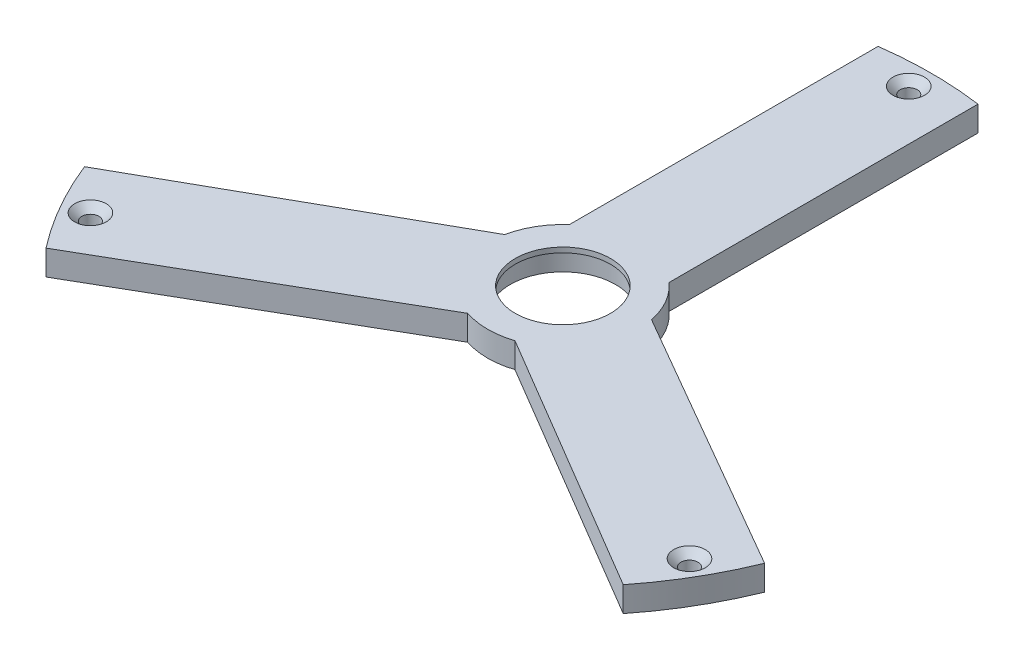
ISO-10303-21;
HEADER;
FILE_DESCRIPTION(('STEP AP214'),'2;1');
FILE_NAME('part.step','',(''),(''),'','','');
FILE_SCHEMA(('AUTOMOTIVE_DESIGN { 1 0 10303 214 1 1 1 1 }'));
ENDSEC;
DATA;
#1=APPLICATION_CONTEXT('core data for automotive mechanical design processes');
#2=APPLICATION_PROTOCOL_DEFINITION('international standard','automotive_design',2000,#1);
#3=PRODUCT_CONTEXT('',#1,'mechanical');
#4=PRODUCT('Part','Part','',(#3));
#5=PRODUCT_RELATED_PRODUCT_CATEGORY('part','',(#4));
#6=PRODUCT_DEFINITION_FORMATION('','',#4);
#7=PRODUCT_DEFINITION_CONTEXT('part definition',#1,'design');
#8=PRODUCT_DEFINITION('design','',#6,#7);
#9=PRODUCT_DEFINITION_SHAPE('','',#8);
#10=(LENGTH_UNIT() NAMED_UNIT(*) SI_UNIT(.MILLI.,.METRE.));
#11=(NAMED_UNIT(*) PLANE_ANGLE_UNIT() SI_UNIT($,.RADIAN.));
#12=(NAMED_UNIT(*) SI_UNIT($,.STERADIAN.) SOLID_ANGLE_UNIT());
#13=UNCERTAINTY_MEASURE_WITH_UNIT(LENGTH_MEASURE(1.E-05),#10,'distance_accuracy_value','');
#14=(GEOMETRIC_REPRESENTATION_CONTEXT(3) GLOBAL_UNCERTAINTY_ASSIGNED_CONTEXT((#13)) GLOBAL_UNIT_ASSIGNED_CONTEXT((#10,
#11,#12)) REPRESENTATION_CONTEXT('',''));
#15=CARTESIAN_POINT('',(0.,0.,0.));
#16=DIRECTION('',(0.,0.,1.));
#17=DIRECTION('',(1.,0.,0.));
#18=AXIS2_PLACEMENT_3D('',#15,#16,#17);
#19=CARTESIAN_POINT('',(0.,5.,0.));
#20=DIRECTION('',(0.,-1.,0.));
#21=DIRECTION('',(0.,0.,-1.));
#22=AXIS2_PLACEMENT_3D('',#19,#20,#21);
#23=CYLINDRICAL_SURFACE('',#22,15.);
#24=CARTESIAN_POINT('',(0.,0.,0.));
#25=DIRECTION('',(0.,1.,0.));
#26=DIRECTION('',(0.,0.,1.));
#27=AXIS2_PLACEMENT_3D('',#24,#25,#26);
#28=CIRCLE('',#27,15.);
#29=CARTESIAN_POINT('',(-4.75321733485036,0.,14.2269787716042));
#30=VERTEX_POINT('',#29);
#31=CARTESIAN_POINT('',(4.68941752869024,0.,14.2481354303506));
#32=VERTEX_POINT('',#31);
#33=EDGE_CURVE('E158',#30,#32,#28,.T.);
#34=ORIENTED_EDGE('',*,*,#33,.T.);
#35=DIRECTION('',(0.,-1.,0.));
#36=VECTOR('',#35,1.);
#37=CARTESIAN_POINT('',(4.68941752869024,5.,14.2481354303506));
#38=LINE('',#37,#36);
#39=CARTESIAN_POINT('',(4.68941752869024,5.,14.2481354303506));
#40=VERTEX_POINT('',#39);
#41=EDGE_CURVE('E11',#40,#32,#38,.T.);
#42=ORIENTED_EDGE('',*,*,#41,.F.);
#43=CARTESIAN_POINT('',(0.,5.,0.));
#44=DIRECTION('',(0.,1.,0.));
#45=DIRECTION('',(0.,0.,1.));
#46=AXIS2_PLACEMENT_3D('',#43,#44,#45);
#47=CIRCLE('',#46,15.);
#48=CARTESIAN_POINT('',(-4.75321733485036,5.,14.2269787716042));
#49=VERTEX_POINT('',#48);
#50=EDGE_CURVE('E181',#49,#40,#47,.T.);
#51=ORIENTED_EDGE('',*,*,#50,.F.);
#52=DIRECTION('',(0.,-1.,0.));
#53=VECTOR('',#52,1.);
#54=CARTESIAN_POINT('',(-4.75321733485036,5.,14.2269787716042));
#55=LINE('',#54,#53);
#56=EDGE_CURVE('E154',#49,#30,#55,.T.);
#57=ORIENTED_EDGE('',*,*,#56,.T.);
#58=EDGE_LOOP('',(#34,#42,#51,#57));
#59=FACE_BOUND('',#58,.T.);
#60=ADVANCED_FACE('F37',(#59),#23,.T.);
#61=CARTESIAN_POINT('',(4.68941752869024,5.,14.2481354303506));
#62=DIRECTION('',(0.509477878302837,0.,-0.860483754361487));
#63=DIRECTION('',(-0.860483754361487,0.,-0.509477878302837));
#64=AXIS2_PLACEMENT_3D('',#61,#62,#63);
#65=PLANE('',#64);
#66=DIRECTION('',(0.860483754361487,0.,0.509477878302837));
#67=VECTOR('',#66,1.);
#68=CARTESIAN_POINT('',(4.68941752869024,0.,14.2481354303506));
#69=LINE('',#68,#67);
#70=CARTESIAN_POINT('',(57.64346216512,0.,45.601329691341));
#71=VERTEX_POINT('',#70);
#72=EDGE_CURVE('E161',#32,#71,#69,.T.);
#73=ORIENTED_EDGE('',*,*,#72,.T.);
#74=DIRECTION('',(0.,-1.,0.));
#75=VECTOR('',#74,1.);
#76=CARTESIAN_POINT('',(57.64346216512,5.,45.601329691341));
#77=LINE('',#76,#75);
#78=CARTESIAN_POINT('',(57.64346216512,5.,45.601329691341));
#79=VERTEX_POINT('',#78);
#80=EDGE_CURVE('E46',#79,#71,#77,.T.);
#81=ORIENTED_EDGE('',*,*,#80,.F.);
#82=DIRECTION('',(0.860483754361487,0.,0.509477878302837));
#83=VECTOR('',#82,1.);
#84=CARTESIAN_POINT('',(4.68941752869024,5.,14.2481354303506));
#85=LINE('',#84,#83);
#86=EDGE_CURVE('E109',#40,#79,#85,.T.);
#87=ORIENTED_EDGE('',*,*,#86,.F.);
#88=ORIENTED_EDGE('',*,*,#41,.T.);
#89=EDGE_LOOP('',(#73,#81,#87,#88));
#90=FACE_BOUND('',#89,.T.);
#91=ADVANCED_FACE('F261',(#90),#65,.F.);
#92=CARTESIAN_POINT('',(0.,5.,0.));
#93=DIRECTION('',(0.,-1.,0.));
#94=DIRECTION('',(0.,0.,-1.));
#95=AXIS2_PLACEMENT_3D('',#92,#93,#94);
#96=CYLINDRICAL_SURFACE('',#95,73.5);
#97=CARTESIAN_POINT('',(0.,0.,0.));
#98=DIRECTION('',(0.,1.,0.));
#99=DIRECTION('',(0.,0.,1.));
#100=AXIS2_PLACEMENT_3D('',#97,#98,#99);
#101=CIRCLE('',#100,73.5);
#102=CARTESIAN_POINT('',(68.0397443830476,0.,27.8000572713356));
#103=VERTEX_POINT('',#102);
#104=EDGE_CURVE('E164',#71,#103,#101,.T.);
#105=ORIENTED_EDGE('',*,*,#104,.T.);
#106=DIRECTION('',(0.,-1.,0.));
#107=VECTOR('',#106,1.);
#108=CARTESIAN_POINT('',(68.0397443830476,5.,27.8000572713356));
#109=LINE('',#108,#107);
#110=CARTESIAN_POINT('',(68.0397443830476,5.,27.8000572713356));
#111=VERTEX_POINT('',#110);
#112=EDGE_CURVE('E200',#111,#103,#109,.T.);
#113=ORIENTED_EDGE('',*,*,#112,.F.);
#114=CARTESIAN_POINT('',(0.,5.,0.));
#115=DIRECTION('',(0.,1.,0.));
#116=DIRECTION('',(0.,0.,1.));
#117=AXIS2_PLACEMENT_3D('',#114,#115,#116);
#118=CIRCLE('',#117,73.5);
#119=EDGE_CURVE('E209',#79,#111,#118,.T.);
#120=ORIENTED_EDGE('',*,*,#119,.F.);
#121=ORIENTED_EDGE('',*,*,#80,.T.);
#122=EDGE_LOOP('',(#105,#113,#120,#121));
#123=FACE_BOUND('',#122,.T.);
#124=ADVANCED_FACE('F207',(#123),#96,.T.);
#125=CARTESIAN_POINT('',(14.6975337027367,5.,-2.99708242411159));
#126=DIRECTION('',(-0.5,0.,0.866025403784439));
#127=DIRECTION('',(0.866025403784439,0.,0.5));
#128=AXIS2_PLACEMENT_3D('',#125,#126,#127);
#129=PLANE('',#128);
#130=DIRECTION('',(-0.866025403784439,0.,-0.5));
#131=VECTOR('',#130,1.);
#132=CARTESIAN_POINT('',(14.6975337027367,0.,-2.99708242411159));
#133=LINE('',#132,#131);
#134=CARTESIAN_POINT('',(14.6975337027367,0.,-2.99708242411159));
#135=VERTEX_POINT('',#134);
#136=EDGE_CURVE('E166',#103,#135,#133,.T.);
#137=ORIENTED_EDGE('',*,*,#136,.T.);
#138=DIRECTION('',(0.,-1.,0.));
#139=VECTOR('',#138,1.);
#140=CARTESIAN_POINT('',(14.6975337027367,5.,-2.99708242411159));
#141=LINE('',#140,#139);
#142=CARTESIAN_POINT('',(14.6975337027367,5.,-2.99708242411159));
#143=VERTEX_POINT('',#142);
#144=EDGE_CURVE('E197',#143,#135,#141,.T.);
#145=ORIENTED_EDGE('',*,*,#144,.F.);
#146=DIRECTION('',(-0.866025403784439,0.,-0.5));
#147=VECTOR('',#146,1.);
#148=CARTESIAN_POINT('',(14.6975337027367,5.,-2.99708242411159));
#149=LINE('',#148,#147);
#150=EDGE_CURVE('E227',#111,#143,#149,.T.);
#151=ORIENTED_EDGE('',*,*,#150,.F.);
#152=ORIENTED_EDGE('',*,*,#112,.T.);
#153=EDGE_LOOP('',(#137,#145,#151,#152));
#154=FACE_BOUND('',#153,.T.);
#155=ADVANCED_FACE('F218',(#154),#129,.F.);
#156=CARTESIAN_POINT('',(0.,5.,0.));
#157=DIRECTION('',(0.,-1.,0.));
#158=DIRECTION('',(0.,0.,-1.));
#159=AXIS2_PLACEMENT_3D('',#156,#157,#158);
#160=CYLINDRICAL_SURFACE('',#159,15.);
#161=CARTESIAN_POINT('',(0.,0.,0.));
#162=DIRECTION('',(0.,1.,0.));
#163=DIRECTION('',(0.,0.,1.));
#164=AXIS2_PLACEMENT_3D('',#161,#162,#163);
#165=CIRCLE('',#164,15.);
#166=CARTESIAN_POINT('',(9.99999999999999,0.,-11.180339887499));
#167=VERTEX_POINT('',#166);
#168=EDGE_CURVE('E168',#135,#167,#165,.T.);
#169=ORIENTED_EDGE('',*,*,#168,.T.);
#170=DIRECTION('',(0.,-1.,0.));
#171=VECTOR('',#170,1.);
#172=CARTESIAN_POINT('',(9.99999999999999,5.,-11.180339887499));
#173=LINE('',#172,#171);
#174=CARTESIAN_POINT('',(9.99999999999999,5.,-11.180339887499));
#175=VERTEX_POINT('',#174);
#176=EDGE_CURVE('E194',#175,#167,#173,.T.);
#177=ORIENTED_EDGE('',*,*,#176,.F.);
#178=CARTESIAN_POINT('',(0.,5.,0.));
#179=DIRECTION('',(0.,1.,0.));
#180=DIRECTION('',(0.,0.,1.));
#181=AXIS2_PLACEMENT_3D('',#178,#179,#180);
#182=CIRCLE('',#181,15.);
#183=EDGE_CURVE('E224',#143,#175,#182,.T.);
#184=ORIENTED_EDGE('',*,*,#183,.F.);
#185=ORIENTED_EDGE('',*,*,#144,.T.);
#186=EDGE_LOOP('',(#169,#177,#184,#185));
#187=FACE_BOUND('',#186,.T.);
#188=ADVANCED_FACE('F222',(#187),#160,.T.);
#189=CARTESIAN_POINT('',(10.,5.,-11.180339887499));
#190=DIRECTION('',(-1.,0.,0.));
#191=DIRECTION('',(0.,0.,1.));
#192=AXIS2_PLACEMENT_3D('',#189,#190,#191);
#193=PLANE('',#192);
#194=DIRECTION('',(0.,0.,-1.));
#195=VECTOR('',#194,1.);
#196=CARTESIAN_POINT('',(10.,0.,-11.180339887499));
#197=LINE('',#196,#195);
#198=CARTESIAN_POINT('',(10.,0.,-72.8165503165317));
#199=VERTEX_POINT('',#198);
#200=EDGE_CURVE('E170',#167,#199,#197,.T.);
#201=ORIENTED_EDGE('',*,*,#200,.T.);
#202=DIRECTION('',(0.,-1.,0.));
#203=VECTOR('',#202,1.);
#204=CARTESIAN_POINT('',(10.,5.,-72.8165503165317));
#205=LINE('',#204,#203);
#206=CARTESIAN_POINT('',(10.,5.,-72.8165503165317));
#207=VERTEX_POINT('',#206);
#208=EDGE_CURVE('E191',#207,#199,#205,.T.);
#209=ORIENTED_EDGE('',*,*,#208,.F.);
#210=DIRECTION('',(0.,0.,-1.));
#211=VECTOR('',#210,1.);
#212=CARTESIAN_POINT('',(10.,5.,-11.180339887499));
#213=LINE('',#212,#211);
#214=EDGE_CURVE('E226',#175,#207,#213,.T.);
#215=ORIENTED_EDGE('',*,*,#214,.F.);
#216=ORIENTED_EDGE('',*,*,#176,.T.);
#217=EDGE_LOOP('',(#201,#209,#215,#216));
#218=FACE_BOUND('',#217,.T.);
#219=ADVANCED_FACE('F274',(#218),#193,.F.);
#220=CARTESIAN_POINT('',(0.,5.,0.));
#221=DIRECTION('',(0.,-1.,0.));
#222=DIRECTION('',(0.,0.,-1.));
#223=AXIS2_PLACEMENT_3D('',#220,#221,#222);
#224=CYLINDRICAL_SURFACE('',#223,73.5);
#225=CARTESIAN_POINT('',(0.,0.,0.));
#226=DIRECTION('',(0.,1.,0.));
#227=DIRECTION('',(0.,0.,1.));
#228=AXIS2_PLACEMENT_3D('',#225,#226,#227);
#229=CIRCLE('',#228,73.5);
#230=CARTESIAN_POINT('',(-9.94431636788529,0.,-72.8241757383866));
#231=VERTEX_POINT('',#230);
#232=EDGE_CURVE('E172',#199,#231,#229,.T.);
#233=ORIENTED_EDGE('',*,*,#232,.T.);
#234=DIRECTION('',(0.,-1.,0.));
#235=VECTOR('',#234,1.);
#236=CARTESIAN_POINT('',(-9.94431636788529,5.,-72.8241757383866));
#237=LINE('',#236,#235);
#238=CARTESIAN_POINT('',(-9.94431636788529,5.,-72.8241757383866));
#239=VERTEX_POINT('',#238);
#240=EDGE_CURVE('E188',#239,#231,#237,.T.);
#241=ORIENTED_EDGE('',*,*,#240,.F.);
#242=CARTESIAN_POINT('',(0.,5.,0.));
#243=DIRECTION('',(0.,1.,0.));
#244=DIRECTION('',(0.,0.,1.));
#245=AXIS2_PLACEMENT_3D('',#242,#243,#244);
#246=CIRCLE('',#245,73.5);
#247=EDGE_CURVE('E229',#207,#239,#246,.T.);
#248=ORIENTED_EDGE('',*,*,#247,.F.);
#249=ORIENTED_EDGE('',*,*,#208,.T.);
#250=EDGE_LOOP('',(#233,#241,#248,#249));
#251=FACE_BOUND('',#250,.T.);
#252=ADVANCED_FACE('F277',(#251),#224,.T.);
#253=CARTESIAN_POINT('',(-9.94431636788531,5.,-11.2298963474917));
#254=DIRECTION('',(1.,0.,0.));
#255=DIRECTION('',(0.,0.,-1.));
#256=AXIS2_PLACEMENT_3D('',#253,#254,#255);
#257=PLANE('',#256);
#258=DIRECTION('',(0.,0.,1.));
#259=VECTOR('',#258,1.);
#260=CARTESIAN_POINT('',(-9.94431636788531,0.,-11.2298963474917));
#261=LINE('',#260,#259);
#262=CARTESIAN_POINT('',(-9.94431636788531,0.,-11.2298963474917));
#263=VERTEX_POINT('',#262);
#264=EDGE_CURVE('E174',#231,#263,#261,.T.);
#265=ORIENTED_EDGE('',*,*,#264,.T.);
#266=DIRECTION('',(0.,-1.,0.));
#267=VECTOR('',#266,1.);
#268=CARTESIAN_POINT('',(-9.94431636788531,5.,-11.2298963474917));
#269=LINE('',#268,#267);
#270=CARTESIAN_POINT('',(-9.94431636788531,5.,-11.2298963474917));
#271=VERTEX_POINT('',#270);
#272=EDGE_CURVE('E185',#271,#263,#269,.T.);
#273=ORIENTED_EDGE('',*,*,#272,.F.);
#274=DIRECTION('',(0.,0.,1.));
#275=VECTOR('',#274,1.);
#276=CARTESIAN_POINT('',(-9.94431636788531,5.,-11.2298963474917));
#277=LINE('',#276,#275);
#278=EDGE_CURVE('E235',#239,#271,#277,.T.);
#279=ORIENTED_EDGE('',*,*,#278,.F.);
#280=ORIENTED_EDGE('',*,*,#240,.T.);
#281=EDGE_LOOP('',(#265,#273,#279,#280));
#282=FACE_BOUND('',#281,.T.);
#283=ADVANCED_FACE('F241',(#282),#257,.F.);
#284=CARTESIAN_POINT('',(0.,5.,0.));
#285=DIRECTION('',(0.,-1.,0.));
#286=DIRECTION('',(0.,0.,-1.));
#287=AXIS2_PLACEMENT_3D('',#284,#285,#286);
#288=CYLINDRICAL_SURFACE('',#287,15.);
#289=CARTESIAN_POINT('',(0.,0.,0.));
#290=DIRECTION('',(0.,1.,0.));
#291=DIRECTION('',(0.,0.,1.));
#292=AXIS2_PLACEMENT_3D('',#289,#290,#291);
#293=CIRCLE('',#292,15.);
#294=CARTESIAN_POINT('',(-14.6838056500031,0.,-3.06363373021944));
#295=VERTEX_POINT('',#294);
#296=EDGE_CURVE('E176',#263,#295,#293,.T.);
#297=ORIENTED_EDGE('',*,*,#296,.T.);
#298=DIRECTION('',(0.,-1.,0.));
#299=VECTOR('',#298,1.);
#300=CARTESIAN_POINT('',(-14.6838056500031,5.,-3.06363373021944));
#301=LINE('',#300,#299);
#302=CARTESIAN_POINT('',(-14.6838056500031,5.,-3.06363373021944));
#303=VERTEX_POINT('',#302);
#304=EDGE_CURVE('E149',#303,#295,#301,.T.);
#305=ORIENTED_EDGE('',*,*,#304,.F.);
#306=CARTESIAN_POINT('',(0.,5.,0.));
#307=DIRECTION('',(0.,1.,0.));
#308=DIRECTION('',(0.,0.,1.));
#309=AXIS2_PLACEMENT_3D('',#306,#307,#308);
#310=CIRCLE('',#309,15.);
#311=EDGE_CURVE('E140',#271,#303,#310,.T.);
#312=ORIENTED_EDGE('',*,*,#311,.F.);
#313=ORIENTED_EDGE('',*,*,#272,.T.);
#314=EDGE_LOOP('',(#297,#305,#312,#313));
#315=FACE_BOUND('',#314,.T.);
#316=ADVANCED_FACE('F245',(#315),#288,.T.);
#317=CARTESIAN_POINT('',(-14.6838056500031,5.,-3.06363373021944));
#318=DIRECTION('',(0.490469701584845,0.,0.871458244454244));
#319=DIRECTION('',(0.871458244454244,0.,-0.490469701584845));
#320=AXIS2_PLACEMENT_3D('',#317,#318,#319);
#321=PLANE('',#320);
#322=DIRECTION('',(-0.871458244454244,0.,0.490469701584845));
#323=VECTOR('',#322,1.);
#324=CARTESIAN_POINT('',(-14.6838056500031,0.,-3.06363373021944));
#325=LINE('',#324,#323);
#326=CARTESIAN_POINT('',(-68.3136410416104,0.,27.1200377514118));
#327=VERTEX_POINT('',#326);
#328=EDGE_CURVE('E148',#295,#327,#325,.T.);
#329=ORIENTED_EDGE('',*,*,#328,.T.);
#330=DIRECTION('',(0.,-1.,0.));
#331=VECTOR('',#330,1.);
#332=CARTESIAN_POINT('',(-68.3136410416104,5.,27.1200377514118));
#333=LINE('',#332,#331);
#334=CARTESIAN_POINT('',(-68.3136410416104,5.,27.1200377514118));
#335=VERTEX_POINT('',#334);
#336=EDGE_CURVE('E145',#335,#327,#333,.T.);
#337=ORIENTED_EDGE('',*,*,#336,.F.);
#338=DIRECTION('',(-0.871458244454244,0.,0.490469701584845));
#339=VECTOR('',#338,1.);
#340=CARTESIAN_POINT('',(-14.6838056500031,5.,-3.06363373021944));
#341=LINE('',#340,#339);
#342=EDGE_CURVE('E134',#303,#335,#341,.T.);
#343=ORIENTED_EDGE('',*,*,#342,.F.);
#344=ORIENTED_EDGE('',*,*,#304,.T.);
#345=EDGE_LOOP('',(#329,#337,#343,#344));
#346=FACE_BOUND('',#345,.T.);
#347=ADVANCED_FACE('F146',(#346),#321,.F.);
#348=CARTESIAN_POINT('',(0.,5.,0.));
#349=DIRECTION('',(0.,-1.,0.));
#350=DIRECTION('',(0.,0.,-1.));
#351=AXIS2_PLACEMENT_3D('',#348,#349,#350);
#352=CYLINDRICAL_SURFACE('',#351,73.5);
#353=CARTESIAN_POINT('',(0.,0.,0.));
#354=DIRECTION('',(0.,1.,0.));
#355=DIRECTION('',(0.,0.,1.));
#356=AXIS2_PLACEMENT_3D('',#353,#354,#355);
#357=CIRCLE('',#356,73.5);
#358=CARTESIAN_POINT('',(-58.095428015162,0.,45.0241184670519));
#359=VERTEX_POINT('',#358);
#360=EDGE_CURVE('E95',#327,#359,#357,.T.);
#361=ORIENTED_EDGE('',*,*,#360,.T.);
#362=DIRECTION('',(0.,-1.,0.));
#363=VECTOR('',#362,1.);
#364=CARTESIAN_POINT('',(-58.095428015162,5.,45.0241184670519));
#365=LINE('',#364,#363);
#366=CARTESIAN_POINT('',(-58.095428015162,5.,45.0241184670519));
#367=VERTEX_POINT('',#366);
#368=EDGE_CURVE('E150',#367,#359,#365,.T.);
#369=ORIENTED_EDGE('',*,*,#368,.F.);
#370=CARTESIAN_POINT('',(0.,5.,0.));
#371=DIRECTION('',(0.,1.,0.));
#372=DIRECTION('',(0.,0.,1.));
#373=AXIS2_PLACEMENT_3D('',#370,#371,#372);
#374=CIRCLE('',#373,73.5);
#375=EDGE_CURVE('E138',#335,#367,#374,.T.);
#376=ORIENTED_EDGE('',*,*,#375,.F.);
#377=ORIENTED_EDGE('',*,*,#336,.T.);
#378=EDGE_LOOP('',(#361,#369,#376,#377));
#379=FACE_BOUND('',#378,.T.);
#380=ADVANCED_FACE('F152',(#379),#352,.T.);
#381=CARTESIAN_POINT('',(-4.75321733485036,5.,14.2269787716042));
#382=DIRECTION('',(-0.5,0.,-0.866025403784439));
#383=DIRECTION('',(-0.866025403784439,0.,0.5));
#384=AXIS2_PLACEMENT_3D('',#381,#382,#383);
#385=PLANE('',#384);
#386=DIRECTION('',(0.866025403784439,0.,-0.5));
#387=VECTOR('',#386,1.);
#388=CARTESIAN_POINT('',(-4.75321733485036,0.,14.2269787716042));
#389=LINE('',#388,#387);
#390=EDGE_CURVE('E101',#359,#30,#389,.T.);
#391=ORIENTED_EDGE('',*,*,#390,.T.);
#392=ORIENTED_EDGE('',*,*,#56,.F.);
#393=DIRECTION('',(0.866025403784439,0.,-0.5));
#394=VECTOR('',#393,1.);
#395=CARTESIAN_POINT('',(-4.75321733485036,5.,14.2269787716042));
#396=LINE('',#395,#394);
#397=EDGE_CURVE('E54',#367,#49,#396,.T.);
#398=ORIENTED_EDGE('',*,*,#397,.F.);
#399=ORIENTED_EDGE('',*,*,#368,.T.);
#400=EDGE_LOOP('',(#391,#392,#398,#399));
#401=FACE_BOUND('',#400,.T.);
#402=ADVANCED_FACE('F249',(#401),#385,.F.);
#403=CARTESIAN_POINT('',(0.,5.,0.));
#404=DIRECTION('',(0.,1.,0.));
#405=DIRECTION('',(0.,0.,1.));
#406=AXIS2_PLACEMENT_3D('',#403,#404,#405);
#407=PLANE('',#406);
#408=CARTESIAN_POINT('',(-59.7557528611222,5.,34.5000000000024));
#409=DIRECTION('',(0.,1.,0.));
#410=DIRECTION('',(0.,0.,1.));
#411=AXIS2_PLACEMENT_3D('',#408,#409,#410);
#412=CIRCLE('',#411,3.15);
#413=CARTESIAN_POINT('',(-59.7557528611222,5.,37.6500000000024));
#414=VERTEX_POINT('',#413);
#415=EDGE_CURVE('E515',#414,#414,#412,.T.);
#416=ORIENTED_EDGE('',*,*,#415,.F.);
#417=EDGE_LOOP('',(#416));
#418=FACE_BOUND('',#417,.T.);
#419=CARTESIAN_POINT('',(0.,5.,-69.));
#420=DIRECTION('',(0.,1.,0.));
#421=DIRECTION('',(0.,0.,1.));
#422=AXIS2_PLACEMENT_3D('',#419,#420,#421);
#423=CIRCLE('',#422,3.15);
#424=CARTESIAN_POINT('',(0.,5.,-65.85));
#425=VERTEX_POINT('',#424);
#426=EDGE_CURVE('E522',#425,#425,#423,.T.);
#427=ORIENTED_EDGE('',*,*,#426,.F.);
#428=EDGE_LOOP('',(#427));
#429=FACE_BOUND('',#428,.T.);
#430=CARTESIAN_POINT('',(59.7557528611304,5.,34.4999999999976));
#431=DIRECTION('',(0.,1.,0.));
#432=DIRECTION('',(0.,0.,1.));
#433=AXIS2_PLACEMENT_3D('',#430,#431,#432);
#434=CIRCLE('',#433,3.15);
#435=CARTESIAN_POINT('',(59.7557528611304,5.,37.6499999999976));
#436=VERTEX_POINT('',#435);
#437=EDGE_CURVE('E531',#436,#436,#434,.T.);
#438=ORIENTED_EDGE('',*,*,#437,.F.);
#439=EDGE_LOOP('',(#438));
#440=FACE_BOUND('',#439,.T.);
#441=CARTESIAN_POINT('',(0.,5.,0.));
#442=DIRECTION('',(0.,1.,0.));
#443=DIRECTION('',(0.,0.,1.));
#444=AXIS2_PLACEMENT_3D('',#441,#442,#443);
#445=CIRCLE('',#444,9.5);
#446=CARTESIAN_POINT('',(0.,5.,9.5));
#447=VERTEX_POINT('',#446);
#448=EDGE_CURVE('E540',#447,#447,#445,.T.);
#449=ORIENTED_EDGE('',*,*,#448,.F.);
#450=EDGE_LOOP('',(#449));
#451=FACE_BOUND('',#450,.T.);
#452=ORIENTED_EDGE('',*,*,#50,.T.);
#453=ORIENTED_EDGE('',*,*,#86,.T.);
#454=ORIENTED_EDGE('',*,*,#119,.T.);
#455=ORIENTED_EDGE('',*,*,#150,.T.);
#456=ORIENTED_EDGE('',*,*,#183,.T.);
#457=ORIENTED_EDGE('',*,*,#214,.T.);
#458=ORIENTED_EDGE('',*,*,#247,.T.);
#459=ORIENTED_EDGE('',*,*,#278,.T.);
#460=ORIENTED_EDGE('',*,*,#311,.T.);
#461=ORIENTED_EDGE('',*,*,#342,.T.);
#462=ORIENTED_EDGE('',*,*,#375,.T.);
#463=ORIENTED_EDGE('',*,*,#397,.T.);
#464=EDGE_LOOP('',(#452,#453,#454,#455,#456,#457,#458,#459,#460,#461,#462,#463));
#465=FACE_BOUND('',#464,.T.);
#466=ADVANCED_FACE('F136',(#418,#429,#440,#451,#465),#407,.T.);
#467=CARTESIAN_POINT('',(0.,0.,0.));
#468=DIRECTION('',(0.,1.,0.));
#469=DIRECTION('',(0.,0.,1.));
#470=AXIS2_PLACEMENT_3D('',#467,#468,#469);
#471=PLANE('',#470);
#472=CARTESIAN_POINT('',(-59.7557528611222,0.,34.5000000000024));
#473=DIRECTION('',(0.,1.,0.));
#474=DIRECTION('',(0.,0.,1.));
#475=AXIS2_PLACEMENT_3D('',#472,#473,#474);
#476=CIRCLE('',#475,1.7);
#477=CARTESIAN_POINT('',(-59.7557528611222,0.,36.2000000000024));
#478=VERTEX_POINT('',#477);
#479=EDGE_CURVE('E517',#478,#478,#476,.T.);
#480=ORIENTED_EDGE('',*,*,#479,.T.);
#481=EDGE_LOOP('',(#480));
#482=FACE_BOUND('',#481,.T.);
#483=CARTESIAN_POINT('',(0.,0.,-69.));
#484=DIRECTION('',(0.,1.,0.));
#485=DIRECTION('',(0.,0.,1.));
#486=AXIS2_PLACEMENT_3D('',#483,#484,#485);
#487=CIRCLE('',#486,1.7);
#488=CARTESIAN_POINT('',(0.,0.,-67.3));
#489=VERTEX_POINT('',#488);
#490=EDGE_CURVE('E528',#489,#489,#487,.T.);
#491=ORIENTED_EDGE('',*,*,#490,.T.);
#492=EDGE_LOOP('',(#491));
#493=FACE_BOUND('',#492,.T.);
#494=CARTESIAN_POINT('',(59.7557528611304,0.,34.4999999999976));
#495=DIRECTION('',(0.,1.,0.));
#496=DIRECTION('',(0.,0.,1.));
#497=AXIS2_PLACEMENT_3D('',#494,#495,#496);
#498=CIRCLE('',#497,1.7);
#499=CARTESIAN_POINT('',(59.7557528611304,0.,36.1999999999976));
#500=VERTEX_POINT('',#499);
#501=EDGE_CURVE('E537',#500,#500,#498,.T.);
#502=ORIENTED_EDGE('',*,*,#501,.T.);
#503=EDGE_LOOP('',(#502));
#504=FACE_BOUND('',#503,.T.);
#505=CARTESIAN_POINT('',(0.,0.,0.));
#506=DIRECTION('',(0.,-1.,0.));
#507=DIRECTION('',(0.,0.,-1.));
#508=AXIS2_PLACEMENT_3D('',#505,#506,#507);
#509=CIRCLE('',#508,10.5);
#510=CARTESIAN_POINT('',(0.,0.,-10.5));
#511=VERTEX_POINT('',#510);
#512=EDGE_CURVE('E545',#511,#511,#509,.T.);
#513=ORIENTED_EDGE('',*,*,#512,.F.);
#514=EDGE_LOOP('',(#513));
#515=FACE_BOUND('',#514,.T.);
#516=ORIENTED_EDGE('',*,*,#33,.F.);
#517=ORIENTED_EDGE('',*,*,#390,.F.);
#518=ORIENTED_EDGE('',*,*,#360,.F.);
#519=ORIENTED_EDGE('',*,*,#328,.F.);
#520=ORIENTED_EDGE('',*,*,#296,.F.);
#521=ORIENTED_EDGE('',*,*,#264,.F.);
#522=ORIENTED_EDGE('',*,*,#232,.F.);
#523=ORIENTED_EDGE('',*,*,#200,.F.);
#524=ORIENTED_EDGE('',*,*,#168,.F.);
#525=ORIENTED_EDGE('',*,*,#136,.F.);
#526=ORIENTED_EDGE('',*,*,#104,.F.);
#527=ORIENTED_EDGE('',*,*,#72,.F.);
#528=EDGE_LOOP('',(#516,#517,#518,#519,#520,#521,#522,#523,#524,#525,#526,#527));
#529=FACE_BOUND('',#528,.T.);
#530=ADVANCED_FACE('F213',(#482,#493,#504,#515,#529),#471,.F.);
#531=CARTESIAN_POINT('',(0.,4.,0.));
#532=DIRECTION('',(0.,-1.,0.));
#533=DIRECTION('',(0.,0.,-1.));
#534=AXIS2_PLACEMENT_3D('',#531,#532,#533);
#535=CYLINDRICAL_SURFACE('',#534,10.5);
#536=CARTESIAN_POINT('',(0.,4.,0.));
#537=DIRECTION('',(0.,-1.,0.));
#538=DIRECTION('',(0.,0.,-1.));
#539=AXIS2_PLACEMENT_3D('',#536,#537,#538);
#540=CIRCLE('',#539,10.5);
#541=CARTESIAN_POINT('',(0.,4.,-10.5));
#542=VERTEX_POINT('',#541);
#543=EDGE_CURVE('E162',#542,#542,#540,.T.);
#544=ORIENTED_EDGE('',*,*,#543,.F.);
#545=EDGE_LOOP('',(#544));
#546=FACE_BOUND('',#545,.T.);
#547=ORIENTED_EDGE('',*,*,#512,.T.);
#548=EDGE_LOOP('',(#547));
#549=FACE_BOUND('',#548,.T.);
#550=ADVANCED_FACE('F307',(#546,#549),#535,.F.);
#551=CARTESIAN_POINT('',(0.,4.,0.));
#552=DIRECTION('',(0.,-1.,0.));
#553=DIRECTION('',(0.,0.,-1.));
#554=AXIS2_PLACEMENT_3D('',#551,#552,#553);
#555=PLANE('',#554);
#556=CARTESIAN_POINT('',(0.,4.,0.));
#557=DIRECTION('',(0.,-1.,0.));
#558=DIRECTION('',(0.,0.,-1.));
#559=AXIS2_PLACEMENT_3D('',#556,#557,#558);
#560=CIRCLE('',#559,9.5);
#561=CARTESIAN_POINT('',(0.,4.,-9.5));
#562=VERTEX_POINT('',#561);
#563=EDGE_CURVE('E40',#562,#562,#560,.T.);
#564=ORIENTED_EDGE('',*,*,#563,.F.);
#565=EDGE_LOOP('',(#564));
#566=FACE_BOUND('',#565,.T.);
#567=ORIENTED_EDGE('',*,*,#543,.T.);
#568=EDGE_LOOP('',(#567));
#569=FACE_BOUND('',#568,.T.);
#570=ADVANCED_FACE('F312',(#566,#569),#555,.T.);
#571=CARTESIAN_POINT('',(0.,1.,0.));
#572=DIRECTION('',(0.,1.,0.));
#573=DIRECTION('',(0.,0.,1.));
#574=AXIS2_PLACEMENT_3D('',#571,#572,#573);
#575=CYLINDRICAL_SURFACE('',#574,9.5);
#576=ORIENTED_EDGE('',*,*,#563,.T.);
#577=EDGE_LOOP('',(#576));
#578=FACE_BOUND('',#577,.T.);
#579=ORIENTED_EDGE('',*,*,#448,.T.);
#580=EDGE_LOOP('',(#579));
#581=FACE_BOUND('',#580,.T.);
#582=ADVANCED_FACE('F325',(#578,#581),#575,.F.);
#583=CARTESIAN_POINT('',(59.7557528611304,5.,34.4999999999976));
#584=DIRECTION('',(0.,1.,0.));
#585=DIRECTION('',(0.,0.,1.));
#586=AXIS2_PLACEMENT_3D('',#583,#584,#585);
#587=CYLINDRICAL_SURFACE('',#586,1.7);
#588=ORIENTED_EDGE('',*,*,#501,.F.);
#589=EDGE_LOOP('',(#588));
#590=FACE_BOUND('',#589,.T.);
#591=CARTESIAN_POINT('',(59.7557528611304,3.55,34.4999999999976));
#592=DIRECTION('',(0.,1.,0.));
#593=DIRECTION('',(0.,0.,1.));
#594=AXIS2_PLACEMENT_3D('',#591,#592,#593);
#595=CIRCLE('',#594,1.7);
#596=CARTESIAN_POINT('',(59.7557528611304,3.55,36.1999999999976));
#597=VERTEX_POINT('',#596);
#598=EDGE_CURVE('E534',#597,#597,#595,.T.);
#599=ORIENTED_EDGE('',*,*,#598,.T.);
#600=EDGE_LOOP('',(#599));
#601=FACE_BOUND('',#600,.T.);
#602=ADVANCED_FACE('F336',(#590,#601),#587,.F.);
#603=CARTESIAN_POINT('',(59.7557528611304,5.,34.4999999999976));
#604=DIRECTION('',(0.,1.,0.));
#605=DIRECTION('',(0.,0.,1.));
#606=AXIS2_PLACEMENT_3D('',#603,#604,#605);
#607=CONICAL_SURFACE('',#606,3.15,0.785398163397449);
#608=ORIENTED_EDGE('',*,*,#598,.F.);
#609=EDGE_LOOP('',(#608));
#610=FACE_BOUND('',#609,.T.);
#611=ORIENTED_EDGE('',*,*,#437,.T.);
#612=EDGE_LOOP('',(#611));
#613=FACE_BOUND('',#612,.T.);
#614=ADVANCED_FACE('F360',(#610,#613),#607,.F.);
#615=CARTESIAN_POINT('',(0.,5.,-69.));
#616=DIRECTION('',(0.,1.,0.));
#617=DIRECTION('',(0.,0.,1.));
#618=AXIS2_PLACEMENT_3D('',#615,#616,#617);
#619=CYLINDRICAL_SURFACE('',#618,1.7);
#620=ORIENTED_EDGE('',*,*,#490,.F.);
#621=EDGE_LOOP('',(#620));
#622=FACE_BOUND('',#621,.T.);
#623=CARTESIAN_POINT('',(0.,3.55,-69.));
#624=DIRECTION('',(0.,1.,0.));
#625=DIRECTION('',(0.,0.,1.));
#626=AXIS2_PLACEMENT_3D('',#623,#624,#625);
#627=CIRCLE('',#626,1.7);
#628=CARTESIAN_POINT('',(0.,3.55,-67.3));
#629=VERTEX_POINT('',#628);
#630=EDGE_CURVE('E525',#629,#629,#627,.T.);
#631=ORIENTED_EDGE('',*,*,#630,.T.);
#632=EDGE_LOOP('',(#631));
#633=FACE_BOUND('',#632,.T.);
#634=ADVANCED_FACE('F371',(#622,#633),#619,.F.);
#635=CARTESIAN_POINT('',(0.,5.,-69.));
#636=DIRECTION('',(0.,1.,0.));
#637=DIRECTION('',(0.,0.,1.));
#638=AXIS2_PLACEMENT_3D('',#635,#636,#637);
#639=CONICAL_SURFACE('',#638,3.15,0.785398163397449);
#640=ORIENTED_EDGE('',*,*,#630,.F.);
#641=EDGE_LOOP('',(#640));
#642=FACE_BOUND('',#641,.T.);
#643=ORIENTED_EDGE('',*,*,#426,.T.);
#644=EDGE_LOOP('',(#643));
#645=FACE_BOUND('',#644,.T.);
#646=ADVANCED_FACE('F382',(#642,#645),#639,.F.);
#647=CARTESIAN_POINT('',(-59.7557528611222,5.,34.5000000000024));
#648=DIRECTION('',(0.,1.,0.));
#649=DIRECTION('',(0.,0.,1.));
#650=AXIS2_PLACEMENT_3D('',#647,#648,#649);
#651=CYLINDRICAL_SURFACE('',#650,1.7);
#652=ORIENTED_EDGE('',*,*,#479,.F.);
#653=EDGE_LOOP('',(#652));
#654=FACE_BOUND('',#653,.T.);
#655=CARTESIAN_POINT('',(-59.7557528611222,3.55,34.5000000000024));
#656=DIRECTION('',(0.,1.,0.));
#657=DIRECTION('',(0.,0.,1.));
#658=AXIS2_PLACEMENT_3D('',#655,#656,#657);
#659=CIRCLE('',#658,1.7);
#660=CARTESIAN_POINT('',(-59.7557528611222,3.55,36.2000000000024));
#661=VERTEX_POINT('',#660);
#662=EDGE_CURVE('E512',#661,#661,#659,.T.);
#663=ORIENTED_EDGE('',*,*,#662,.T.);
#664=EDGE_LOOP('',(#663));
#665=FACE_BOUND('',#664,.T.);
#666=ADVANCED_FACE('F393',(#654,#665),#651,.F.);
#667=CARTESIAN_POINT('',(-59.7557528611222,5.,34.5000000000024));
#668=DIRECTION('',(0.,1.,0.));
#669=DIRECTION('',(0.,0.,1.));
#670=AXIS2_PLACEMENT_3D('',#667,#668,#669);
#671=CONICAL_SURFACE('',#670,3.15,0.785398163397449);
#672=ORIENTED_EDGE('',*,*,#662,.F.);
#673=EDGE_LOOP('',(#672));
#674=FACE_BOUND('',#673,.T.);
#675=ORIENTED_EDGE('',*,*,#415,.T.);
#676=EDGE_LOOP('',(#675));
#677=FACE_BOUND('',#676,.T.);
#678=ADVANCED_FACE('F404',(#674,#677),#671,.F.);
#679=CLOSED_SHELL('',(#60,#91,#124,#155,#188,#219,#252,#283,#316,#347,#380,#402,#466,#530,#550,
#570,#582,#602,#614,#634,#646,#666,#678));
#680=MANIFOLD_SOLID_BREP('B2',#679);
#681=ADVANCED_BREP_SHAPE_REPRESENTATION('',(#18,#680),#14);
#682=SHAPE_DEFINITION_REPRESENTATION(#9,#681);
ENDSEC;
END-ISO-10303-21;
